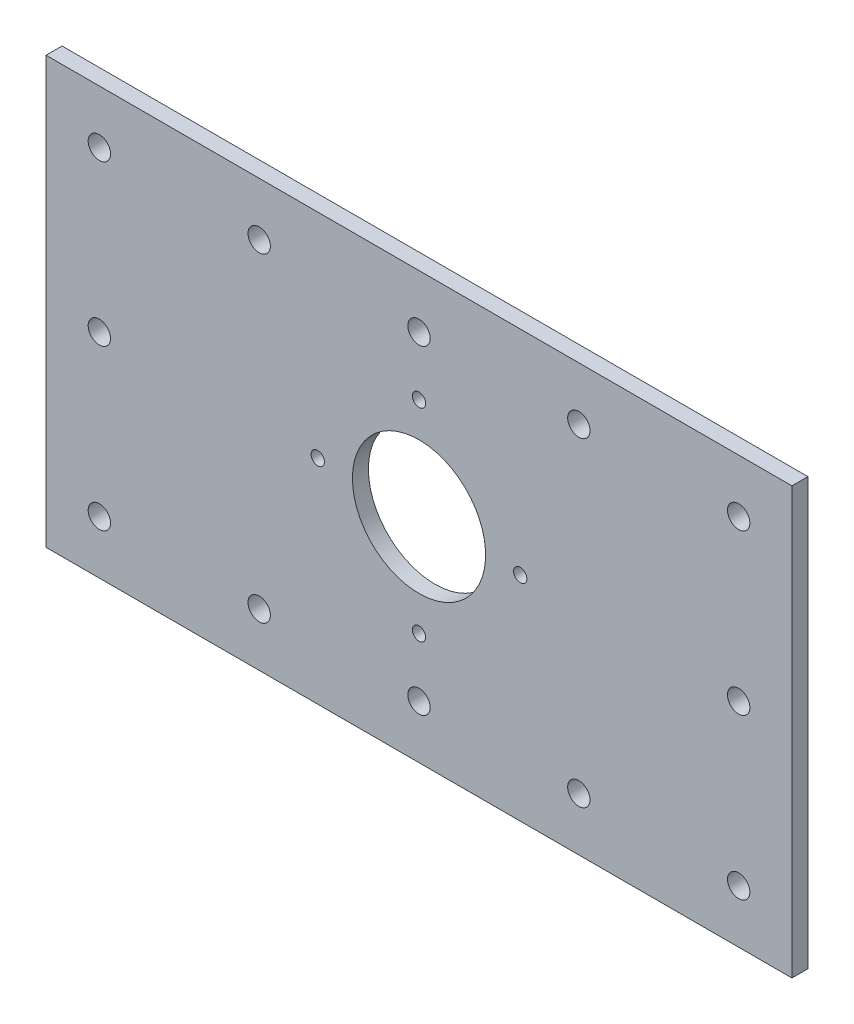
ISO-10303-21;
HEADER;
FILE_DESCRIPTION(('STEP AP214'),'2;1');
FILE_NAME('part.step','',(''),(''),'','','');
FILE_SCHEMA(('AUTOMOTIVE_DESIGN { 1 0 10303 214 1 1 1 1 }'));
ENDSEC;
DATA;
#1=APPLICATION_CONTEXT('core data for automotive mechanical design processes');
#2=APPLICATION_PROTOCOL_DEFINITION('international standard','automotive_design',2000,#1);
#3=PRODUCT_CONTEXT('',#1,'mechanical');
#4=PRODUCT('Part','Part','',(#3));
#5=PRODUCT_RELATED_PRODUCT_CATEGORY('part','',(#4));
#6=PRODUCT_DEFINITION_FORMATION('','',#4);
#7=PRODUCT_DEFINITION_CONTEXT('part definition',#1,'design');
#8=PRODUCT_DEFINITION('design','',#6,#7);
#9=PRODUCT_DEFINITION_SHAPE('','',#8);
#10=(LENGTH_UNIT() NAMED_UNIT(*) SI_UNIT(.MILLI.,.METRE.));
#11=(NAMED_UNIT(*) PLANE_ANGLE_UNIT() SI_UNIT($,.RADIAN.));
#12=(NAMED_UNIT(*) SI_UNIT($,.STERADIAN.) SOLID_ANGLE_UNIT());
#13=UNCERTAINTY_MEASURE_WITH_UNIT(LENGTH_MEASURE(1.E-05),#10,'distance_accuracy_value','');
#14=(GEOMETRIC_REPRESENTATION_CONTEXT(3) GLOBAL_UNCERTAINTY_ASSIGNED_CONTEXT((#13)) GLOBAL_UNIT_ASSIGNED_CONTEXT((#10,
#11,#12)) REPRESENTATION_CONTEXT('',''));
#15=CARTESIAN_POINT('',(0.,0.,0.));
#16=DIRECTION('',(0.,0.,1.));
#17=DIRECTION('',(1.,0.,0.));
#18=AXIS2_PLACEMENT_3D('',#15,#16,#17);
#19=CARTESIAN_POINT('',(0.,0.,3.));
#20=DIRECTION('',(0.,0.,1.));
#21=DIRECTION('',(1.,0.,0.));
#22=AXIS2_PLACEMENT_3D('',#19,#20,#21);
#23=PLANE('',#22);
#24=CARTESIAN_POINT('',(0.,0.,3.));
#25=DIRECTION('',(0.,0.,-1.));
#26=DIRECTION('',(-1.,0.,0.));
#27=AXIS2_PLACEMENT_3D('',#24,#25,#26);
#28=CIRCLE('',#27,12.5);
#29=CARTESIAN_POINT('',(-12.5,0.,3.));
#30=VERTEX_POINT('',#29);
#31=EDGE_CURVE('E258',#30,#30,#28,.T.);
#32=ORIENTED_EDGE('',*,*,#31,.T.);
#33=EDGE_LOOP('',(#32));
#34=FACE_BOUND('',#33,.T.);
#35=CARTESIAN_POINT('',(-19.,0.,3.));
#36=DIRECTION('',(0.,0.,-1.));
#37=DIRECTION('',(-1.,0.,0.));
#38=AXIS2_PLACEMENT_3D('',#35,#36,#37);
#39=CIRCLE('',#38,1.25);
#40=CARTESIAN_POINT('',(-20.25,0.,3.));
#41=VERTEX_POINT('',#40);
#42=EDGE_CURVE('E130',#41,#41,#39,.T.);
#43=ORIENTED_EDGE('',*,*,#42,.T.);
#44=EDGE_LOOP('',(#43));
#45=FACE_BOUND('',#44,.T.);
#46=CARTESIAN_POINT('',(0.,-19.,3.));
#47=DIRECTION('',(0.,0.,-1.));
#48=DIRECTION('',(-1.,0.,0.));
#49=AXIS2_PLACEMENT_3D('',#46,#47,#48);
#50=CIRCLE('',#49,1.25);
#51=CARTESIAN_POINT('',(-1.24999999999993,-19.,3.));
#52=VERTEX_POINT('',#51);
#53=EDGE_CURVE('E251',#52,#52,#50,.T.);
#54=ORIENTED_EDGE('',*,*,#53,.T.);
#55=EDGE_LOOP('',(#54));
#56=FACE_BOUND('',#55,.T.);
#57=CARTESIAN_POINT('',(19.,1.32676290876039E-13,3.));
#58=DIRECTION('',(0.,0.,-1.));
#59=DIRECTION('',(-1.,0.,0.));
#60=AXIS2_PLACEMENT_3D('',#57,#58,#59);
#61=CIRCLE('',#60,1.25);
#62=CARTESIAN_POINT('',(17.75,1.32676290876039E-13,3.));
#63=VERTEX_POINT('',#62);
#64=EDGE_CURVE('E247',#63,#63,#61,.T.);
#65=ORIENTED_EDGE('',*,*,#64,.T.);
#66=EDGE_LOOP('',(#65));
#67=FACE_BOUND('',#66,.T.);
#68=CARTESIAN_POINT('',(-1.99014436314059E-13,19.,3.));
#69=DIRECTION('',(0.,0.,-1.));
#70=DIRECTION('',(-1.,0.,0.));
#71=AXIS2_PLACEMENT_3D('',#68,#69,#70);
#72=CIRCLE('',#71,1.25);
#73=CARTESIAN_POINT('',(-1.2500000000002,19.,3.));
#74=VERTEX_POINT('',#73);
#75=EDGE_CURVE('E243',#74,#74,#72,.T.);
#76=ORIENTED_EDGE('',*,*,#75,.T.);
#77=EDGE_LOOP('',(#76));
#78=FACE_BOUND('',#77,.T.);
#79=CARTESIAN_POINT('',(60.0000000000005,0.,3.));
#80=DIRECTION('',(0.,0.,-1.));
#81=DIRECTION('',(-1.,0.,0.));
#82=AXIS2_PLACEMENT_3D('',#79,#80,#81);
#83=CIRCLE('',#82,2.1);
#84=CARTESIAN_POINT('',(57.9000000000005,0.,3.));
#85=VERTEX_POINT('',#84);
#86=EDGE_CURVE('E198',#85,#85,#83,.T.);
#87=ORIENTED_EDGE('',*,*,#86,.T.);
#88=EDGE_LOOP('',(#87));
#89=FACE_BOUND('',#88,.T.);
#90=CARTESIAN_POINT('',(60.0000000000003,-30.,3.));
#91=DIRECTION('',(0.,0.,-1.));
#92=DIRECTION('',(-1.,0.,0.));
#93=AXIS2_PLACEMENT_3D('',#90,#91,#92);
#94=CIRCLE('',#93,2.1);
#95=CARTESIAN_POINT('',(57.9000000000003,-30.,3.));
#96=VERTEX_POINT('',#95);
#97=EDGE_CURVE('E189',#96,#96,#94,.T.);
#98=ORIENTED_EDGE('',*,*,#97,.T.);
#99=EDGE_LOOP('',(#98));
#100=FACE_BOUND('',#99,.T.);
#101=CARTESIAN_POINT('',(-3.12396350297154E-13,-30.,3.));
#102=DIRECTION('',(0.,0.,-1.));
#103=DIRECTION('',(-1.,0.,0.));
#104=AXIS2_PLACEMENT_3D('',#101,#102,#103);
#105=CIRCLE('',#104,2.09999999999999);
#106=CARTESIAN_POINT('',(-2.10000000000031,-30.,3.));
#107=VERTEX_POINT('',#106);
#108=EDGE_CURVE('E213',#107,#107,#105,.T.);
#109=ORIENTED_EDGE('',*,*,#108,.T.);
#110=EDGE_LOOP('',(#109));
#111=FACE_BOUND('',#110,.T.);
#112=CARTESIAN_POINT('',(29.9999999999997,-30.,3.));
#113=DIRECTION('',(0.,0.,-1.));
#114=DIRECTION('',(-1.,0.,0.));
#115=AXIS2_PLACEMENT_3D('',#112,#113,#114);
#116=CIRCLE('',#115,2.09999999999998);
#117=CARTESIAN_POINT('',(27.8999999999997,-30.,3.));
#118=VERTEX_POINT('',#117);
#119=EDGE_CURVE('E222',#118,#118,#116,.T.);
#120=ORIENTED_EDGE('',*,*,#119,.T.);
#121=EDGE_LOOP('',(#120));
#122=FACE_BOUND('',#121,.T.);
#123=CARTESIAN_POINT('',(-30.0000000000003,-30.,3.));
#124=DIRECTION('',(0.,0.,-1.));
#125=DIRECTION('',(-1.,0.,0.));
#126=AXIS2_PLACEMENT_3D('',#123,#124,#125);
#127=CIRCLE('',#126,2.09999999999999);
#128=CARTESIAN_POINT('',(-32.1000000000003,-30.,3.));
#129=VERTEX_POINT('',#128);
#130=EDGE_CURVE('E217',#129,#129,#127,.T.);
#131=ORIENTED_EDGE('',*,*,#130,.T.);
#132=EDGE_LOOP('',(#131));
#133=FACE_BOUND('',#132,.T.);
#134=DIRECTION('',(0.,1.,0.));
#135=VECTOR('',#134,1.);
#136=CARTESIAN_POINT('',(70.,40.,3.));
#137=LINE('',#136,#135);
#138=CARTESIAN_POINT('',(70.,-40.,3.));
#139=VERTEX_POINT('',#138);
#140=CARTESIAN_POINT('',(70.,40.,3.));
#141=VERTEX_POINT('',#140);
#142=EDGE_CURVE('E93',#139,#141,#137,.T.);
#143=ORIENTED_EDGE('',*,*,#142,.T.);
#144=DIRECTION('',(-1.,0.,0.));
#145=VECTOR('',#144,1.);
#146=CARTESIAN_POINT('',(-70.,40.,3.));
#147=LINE('',#146,#145);
#148=CARTESIAN_POINT('',(-70.,40.,3.));
#149=VERTEX_POINT('',#148);
#150=EDGE_CURVE('E88',#141,#149,#147,.T.);
#151=ORIENTED_EDGE('',*,*,#150,.T.);
#152=DIRECTION('',(0.,-1.,0.));
#153=VECTOR('',#152,1.);
#154=CARTESIAN_POINT('',(-70.,40.,3.));
#155=LINE('',#154,#153);
#156=CARTESIAN_POINT('',(-70.,-40.,3.));
#157=VERTEX_POINT('',#156);
#158=EDGE_CURVE('E91',#149,#157,#155,.T.);
#159=ORIENTED_EDGE('',*,*,#158,.T.);
#160=DIRECTION('',(1.,0.,0.));
#161=VECTOR('',#160,1.);
#162=CARTESIAN_POINT('',(-70.,-40.,3.));
#163=LINE('',#162,#161);
#164=EDGE_CURVE('E58',#157,#139,#163,.T.);
#165=ORIENTED_EDGE('',*,*,#164,.T.);
#166=EDGE_LOOP('',(#143,#151,#159,#165));
#167=FACE_BOUND('',#166,.T.);
#168=CARTESIAN_POINT('',(-3.12396350297154E-13,30.,3.));
#169=DIRECTION('',(0.,0.,1.));
#170=DIRECTION('',(1.,0.,0.));
#171=AXIS2_PLACEMENT_3D('',#168,#169,#170);
#172=CIRCLE('',#171,2.1);
#173=CARTESIAN_POINT('',(2.09999999999968,30.,3.));
#174=VERTEX_POINT('',#173);
#175=EDGE_CURVE('E155',#174,#174,#172,.T.);
#176=ORIENTED_EDGE('',*,*,#175,.F.);
#177=EDGE_LOOP('',(#176));
#178=FACE_BOUND('',#177,.T.);
#179=CARTESIAN_POINT('',(-30.0000000000003,30.,3.));
#180=DIRECTION('',(0.,0.,1.));
#181=DIRECTION('',(1.,0.,0.));
#182=AXIS2_PLACEMENT_3D('',#179,#180,#181);
#183=CIRCLE('',#182,2.09999999999999);
#184=CARTESIAN_POINT('',(-27.9000000000003,30.,3.));
#185=VERTEX_POINT('',#184);
#186=EDGE_CURVE('E164',#185,#185,#183,.T.);
#187=ORIENTED_EDGE('',*,*,#186,.F.);
#188=EDGE_LOOP('',(#187));
#189=FACE_BOUND('',#188,.T.);
#190=CARTESIAN_POINT('',(-60.0000000000003,29.9999999999988,3.));
#191=DIRECTION('',(0.,0.,1.));
#192=DIRECTION('',(1.,0.,0.));
#193=AXIS2_PLACEMENT_3D('',#190,#191,#192);
#194=CIRCLE('',#193,2.1);
#195=CARTESIAN_POINT('',(-57.9000000000003,29.9999999999988,3.));
#196=VERTEX_POINT('',#195);
#197=EDGE_CURVE('E172',#196,#196,#194,.T.);
#198=ORIENTED_EDGE('',*,*,#197,.F.);
#199=EDGE_LOOP('',(#198));
#200=FACE_BOUND('',#199,.T.);
#201=CARTESIAN_POINT('',(-60.0000000000005,-1.2490009027033E-12,3.));
#202=DIRECTION('',(0.,0.,1.));
#203=DIRECTION('',(1.,0.,0.));
#204=AXIS2_PLACEMENT_3D('',#201,#202,#203);
#205=CIRCLE('',#204,2.1);
#206=CARTESIAN_POINT('',(-57.9000000000005,-1.2490009027033E-12,3.));
#207=VERTEX_POINT('',#206);
#208=EDGE_CURVE('E180',#207,#207,#205,.T.);
#209=ORIENTED_EDGE('',*,*,#208,.F.);
#210=EDGE_LOOP('',(#209));
#211=FACE_BOUND('',#210,.T.);
#212=CARTESIAN_POINT('',(-59.9999999999997,-30.0000000000013,3.));
#213=DIRECTION('',(0.,0.,1.));
#214=DIRECTION('',(1.,0.,0.));
#215=AXIS2_PLACEMENT_3D('',#212,#213,#214);
#216=CIRCLE('',#215,2.1);
#217=CARTESIAN_POINT('',(-57.8999999999997,-30.0000000000013,3.));
#218=VERTEX_POINT('',#217);
#219=EDGE_CURVE('E188',#218,#218,#216,.T.);
#220=ORIENTED_EDGE('',*,*,#219,.F.);
#221=EDGE_LOOP('',(#220));
#222=FACE_BOUND('',#221,.T.);
#223=CARTESIAN_POINT('',(59.9999999999997,30.,3.));
#224=DIRECTION('',(0.,0.,1.));
#225=DIRECTION('',(1.,0.,0.));
#226=AXIS2_PLACEMENT_3D('',#223,#224,#225);
#227=CIRCLE('',#226,2.1);
#228=CARTESIAN_POINT('',(62.0999999999997,30.,3.));
#229=VERTEX_POINT('',#228);
#230=EDGE_CURVE('E145',#229,#229,#227,.T.);
#231=ORIENTED_EDGE('',*,*,#230,.F.);
#232=EDGE_LOOP('',(#231));
#233=FACE_BOUND('',#232,.T.);
#234=CARTESIAN_POINT('',(29.9999999999997,30.,3.));
#235=DIRECTION('',(0.,0.,1.));
#236=DIRECTION('',(1.,0.,0.));
#237=AXIS2_PLACEMENT_3D('',#234,#235,#236);
#238=CIRCLE('',#237,2.1);
#239=CARTESIAN_POINT('',(32.0999999999997,30.,3.));
#240=VERTEX_POINT('',#239);
#241=EDGE_CURVE('E206',#240,#240,#238,.T.);
#242=ORIENTED_EDGE('',*,*,#241,.F.);
#243=EDGE_LOOP('',(#242));
#244=FACE_BOUND('',#243,.T.);
#245=ADVANCED_FACE('F38',(#34,#45,#56,#67,#78,#89,#100,#111,#122,#133,#167,#178,#189,#200,#211,
#222,#233,#244),#23,.T.);
#246=CARTESIAN_POINT('',(0.,0.,0.));
#247=DIRECTION('',(0.,0.,1.));
#248=DIRECTION('',(1.,0.,0.));
#249=AXIS2_PLACEMENT_3D('',#246,#247,#248);
#250=PLANE('',#249);
#251=CARTESIAN_POINT('',(0.,0.,0.));
#252=DIRECTION('',(0.,0.,1.));
#253=DIRECTION('',(1.,0.,0.));
#254=AXIS2_PLACEMENT_3D('',#251,#252,#253);
#255=CIRCLE('',#254,12.5);
#256=CARTESIAN_POINT('',(12.5,0.,0.));
#257=VERTEX_POINT('',#256);
#258=EDGE_CURVE('E42',#257,#257,#255,.T.);
#259=ORIENTED_EDGE('',*,*,#258,.T.);
#260=EDGE_LOOP('',(#259));
#261=FACE_BOUND('',#260,.T.);
#262=CARTESIAN_POINT('',(-19.,0.,0.));
#263=DIRECTION('',(0.,0.,1.));
#264=DIRECTION('',(1.,0.,0.));
#265=AXIS2_PLACEMENT_3D('',#262,#263,#264);
#266=CIRCLE('',#265,1.25);
#267=CARTESIAN_POINT('',(-17.75,0.,0.));
#268=VERTEX_POINT('',#267);
#269=EDGE_CURVE('E137',#268,#268,#266,.T.);
#270=ORIENTED_EDGE('',*,*,#269,.T.);
#271=EDGE_LOOP('',(#270));
#272=FACE_BOUND('',#271,.T.);
#273=CARTESIAN_POINT('',(0.,-19.,0.));
#274=DIRECTION('',(0.,0.,1.));
#275=DIRECTION('',(1.,0.,0.));
#276=AXIS2_PLACEMENT_3D('',#273,#274,#275);
#277=CIRCLE('',#276,1.25);
#278=CARTESIAN_POINT('',(1.25000000000007,-19.,0.));
#279=VERTEX_POINT('',#278);
#280=EDGE_CURVE('E134',#279,#279,#277,.T.);
#281=ORIENTED_EDGE('',*,*,#280,.T.);
#282=EDGE_LOOP('',(#281));
#283=FACE_BOUND('',#282,.T.);
#284=CARTESIAN_POINT('',(19.,1.32676290876039E-13,0.));
#285=DIRECTION('',(0.,0.,1.));
#286=DIRECTION('',(1.,0.,0.));
#287=AXIS2_PLACEMENT_3D('',#284,#285,#286);
#288=CIRCLE('',#287,1.25);
#289=CARTESIAN_POINT('',(20.25,1.32676290876039E-13,0.));
#290=VERTEX_POINT('',#289);
#291=EDGE_CURVE('E129',#290,#290,#288,.T.);
#292=ORIENTED_EDGE('',*,*,#291,.T.);
#293=EDGE_LOOP('',(#292));
#294=FACE_BOUND('',#293,.T.);
#295=CARTESIAN_POINT('',(-1.99014436314059E-13,19.,0.));
#296=DIRECTION('',(0.,0.,1.));
#297=DIRECTION('',(1.,0.,0.));
#298=AXIS2_PLACEMENT_3D('',#295,#296,#297);
#299=CIRCLE('',#298,1.25);
#300=CARTESIAN_POINT('',(1.2499999999998,19.,0.));
#301=VERTEX_POINT('',#300);
#302=EDGE_CURVE('E125',#301,#301,#299,.T.);
#303=ORIENTED_EDGE('',*,*,#302,.T.);
#304=EDGE_LOOP('',(#303));
#305=FACE_BOUND('',#304,.T.);
#306=CARTESIAN_POINT('',(59.9999999999997,30.,0.));
#307=DIRECTION('',(0.,0.,1.));
#308=DIRECTION('',(1.,0.,0.));
#309=AXIS2_PLACEMENT_3D('',#306,#307,#308);
#310=CIRCLE('',#309,2.1);
#311=CARTESIAN_POINT('',(62.0999999999997,30.,0.));
#312=VERTEX_POINT('',#311);
#313=EDGE_CURVE('E140',#312,#312,#310,.T.);
#314=ORIENTED_EDGE('',*,*,#313,.T.);
#315=EDGE_LOOP('',(#314));
#316=FACE_BOUND('',#315,.T.);
#317=CARTESIAN_POINT('',(-60.0000000000005,-1.2490009027033E-12,0.));
#318=DIRECTION('',(0.,0.,1.));
#319=DIRECTION('',(1.,0.,0.));
#320=AXIS2_PLACEMENT_3D('',#317,#318,#319);
#321=CIRCLE('',#320,2.1);
#322=CARTESIAN_POINT('',(-57.9000000000005,-1.2490009027033E-12,0.));
#323=VERTEX_POINT('',#322);
#324=EDGE_CURVE('E184',#323,#323,#321,.T.);
#325=ORIENTED_EDGE('',*,*,#324,.T.);
#326=EDGE_LOOP('',(#325));
#327=FACE_BOUND('',#326,.T.);
#328=CARTESIAN_POINT('',(-30.0000000000003,30.,0.));
#329=DIRECTION('',(0.,0.,1.));
#330=DIRECTION('',(1.,0.,0.));
#331=AXIS2_PLACEMENT_3D('',#328,#329,#330);
#332=CIRCLE('',#331,2.09999999999999);
#333=CARTESIAN_POINT('',(-27.9000000000003,30.,0.));
#334=VERTEX_POINT('',#333);
#335=EDGE_CURVE('E168',#334,#334,#332,.T.);
#336=ORIENTED_EDGE('',*,*,#335,.T.);
#337=EDGE_LOOP('',(#336));
#338=FACE_BOUND('',#337,.T.);
#339=DIRECTION('',(0.,1.,0.));
#340=VECTOR('',#339,1.);
#341=CARTESIAN_POINT('',(70.,40.,0.));
#342=LINE('',#341,#340);
#343=CARTESIAN_POINT('',(70.,-40.,0.));
#344=VERTEX_POINT('',#343);
#345=CARTESIAN_POINT('',(70.,40.,0.));
#346=VERTEX_POINT('',#345);
#347=EDGE_CURVE('E110',#344,#346,#342,.T.);
#348=ORIENTED_EDGE('',*,*,#347,.F.);
#349=DIRECTION('',(1.,0.,0.));
#350=VECTOR('',#349,1.);
#351=CARTESIAN_POINT('',(-70.,-40.,0.));
#352=LINE('',#351,#350);
#353=CARTESIAN_POINT('',(-70.,-40.,0.));
#354=VERTEX_POINT('',#353);
#355=EDGE_CURVE('E81',#354,#344,#352,.T.);
#356=ORIENTED_EDGE('',*,*,#355,.F.);
#357=DIRECTION('',(0.,-1.,0.));
#358=VECTOR('',#357,1.);
#359=CARTESIAN_POINT('',(-70.,40.,0.));
#360=LINE('',#359,#358);
#361=CARTESIAN_POINT('',(-70.,40.,0.));
#362=VERTEX_POINT('',#361);
#363=EDGE_CURVE('E75',#362,#354,#360,.T.);
#364=ORIENTED_EDGE('',*,*,#363,.F.);
#365=DIRECTION('',(-1.,0.,0.));
#366=VECTOR('',#365,1.);
#367=CARTESIAN_POINT('',(-70.,40.,0.));
#368=LINE('',#367,#366);
#369=EDGE_CURVE('E98',#346,#362,#368,.T.);
#370=ORIENTED_EDGE('',*,*,#369,.F.);
#371=EDGE_LOOP('',(#348,#356,#364,#370));
#372=FACE_BOUND('',#371,.T.);
#373=CARTESIAN_POINT('',(-30.0000000000003,-30.,0.));
#374=DIRECTION('',(0.,0.,-1.));
#375=DIRECTION('',(-1.,0.,0.));
#376=AXIS2_PLACEMENT_3D('',#373,#374,#375);
#377=CIRCLE('',#376,2.09999999999999);
#378=CARTESIAN_POINT('',(-32.1000000000003,-30.,0.));
#379=VERTEX_POINT('',#378);
#380=EDGE_CURVE('E114',#379,#379,#377,.T.);
#381=ORIENTED_EDGE('',*,*,#380,.F.);
#382=EDGE_LOOP('',(#381));
#383=FACE_BOUND('',#382,.T.);
#384=CARTESIAN_POINT('',(-3.12396350297154E-13,30.,0.));
#385=DIRECTION('',(0.,0.,1.));
#386=DIRECTION('',(1.,0.,0.));
#387=AXIS2_PLACEMENT_3D('',#384,#385,#386);
#388=CIRCLE('',#387,2.1);
#389=CARTESIAN_POINT('',(2.09999999999968,30.,0.));
#390=VERTEX_POINT('',#389);
#391=EDGE_CURVE('E160',#390,#390,#388,.T.);
#392=ORIENTED_EDGE('',*,*,#391,.T.);
#393=EDGE_LOOP('',(#392));
#394=FACE_BOUND('',#393,.T.);
#395=CARTESIAN_POINT('',(-60.0000000000003,29.9999999999988,0.));
#396=DIRECTION('',(0.,0.,1.));
#397=DIRECTION('',(1.,0.,0.));
#398=AXIS2_PLACEMENT_3D('',#395,#396,#397);
#399=CIRCLE('',#398,2.1);
#400=CARTESIAN_POINT('',(-57.9000000000003,29.9999999999988,0.));
#401=VERTEX_POINT('',#400);
#402=EDGE_CURVE('E176',#401,#401,#399,.T.);
#403=ORIENTED_EDGE('',*,*,#402,.T.);
#404=EDGE_LOOP('',(#403));
#405=FACE_BOUND('',#404,.T.);
#406=CARTESIAN_POINT('',(-59.9999999999997,-30.0000000000013,0.));
#407=DIRECTION('',(0.,0.,1.));
#408=DIRECTION('',(1.,0.,0.));
#409=AXIS2_PLACEMENT_3D('',#406,#407,#408);
#410=CIRCLE('',#409,2.1);
#411=CARTESIAN_POINT('',(-57.8999999999997,-30.0000000000013,0.));
#412=VERTEX_POINT('',#411);
#413=EDGE_CURVE('E151',#412,#412,#410,.T.);
#414=ORIENTED_EDGE('',*,*,#413,.T.);
#415=EDGE_LOOP('',(#414));
#416=FACE_BOUND('',#415,.T.);
#417=CARTESIAN_POINT('',(29.9999999999997,-30.,0.));
#418=DIRECTION('',(0.,0.,-1.));
#419=DIRECTION('',(-1.,0.,0.));
#420=AXIS2_PLACEMENT_3D('',#417,#418,#419);
#421=CIRCLE('',#420,2.09999999999998);
#422=CARTESIAN_POINT('',(27.8999999999997,-30.,0.));
#423=VERTEX_POINT('',#422);
#424=EDGE_CURVE('E193',#423,#423,#421,.T.);
#425=ORIENTED_EDGE('',*,*,#424,.F.);
#426=EDGE_LOOP('',(#425));
#427=FACE_BOUND('',#426,.T.);
#428=CARTESIAN_POINT('',(-3.12396350297154E-13,-30.,0.));
#429=DIRECTION('',(0.,0.,-1.));
#430=DIRECTION('',(-1.,0.,0.));
#431=AXIS2_PLACEMENT_3D('',#428,#429,#430);
#432=CIRCLE('',#431,2.09999999999999);
#433=CARTESIAN_POINT('',(-2.10000000000031,-30.,0.));
#434=VERTEX_POINT('',#433);
#435=EDGE_CURVE('E218',#434,#434,#432,.T.);
#436=ORIENTED_EDGE('',*,*,#435,.F.);
#437=EDGE_LOOP('',(#436));
#438=FACE_BOUND('',#437,.T.);
#439=CARTESIAN_POINT('',(60.0000000000003,-30.,0.));
#440=DIRECTION('',(0.,0.,-1.));
#441=DIRECTION('',(-1.,0.,0.));
#442=AXIS2_PLACEMENT_3D('',#439,#440,#441);
#443=CIRCLE('',#442,2.1);
#444=CARTESIAN_POINT('',(57.9000000000003,-30.,0.));
#445=VERTEX_POINT('',#444);
#446=EDGE_CURVE('E194',#445,#445,#443,.T.);
#447=ORIENTED_EDGE('',*,*,#446,.F.);
#448=EDGE_LOOP('',(#447));
#449=FACE_BOUND('',#448,.T.);
#450=CARTESIAN_POINT('',(60.0000000000005,0.,0.));
#451=DIRECTION('',(0.,0.,-1.));
#452=DIRECTION('',(-1.,0.,0.));
#453=AXIS2_PLACEMENT_3D('',#450,#451,#452);
#454=CIRCLE('',#453,2.1);
#455=CARTESIAN_POINT('',(57.9000000000005,0.,0.));
#456=VERTEX_POINT('',#455);
#457=EDGE_CURVE('E202',#456,#456,#454,.T.);
#458=ORIENTED_EDGE('',*,*,#457,.F.);
#459=EDGE_LOOP('',(#458));
#460=FACE_BOUND('',#459,.T.);
#461=CARTESIAN_POINT('',(29.9999999999997,30.,0.));
#462=DIRECTION('',(0.,0.,1.));
#463=DIRECTION('',(1.,0.,0.));
#464=AXIS2_PLACEMENT_3D('',#461,#462,#463);
#465=CIRCLE('',#464,2.1);
#466=CARTESIAN_POINT('',(32.0999999999997,30.,0.));
#467=VERTEX_POINT('',#466);
#468=EDGE_CURVE('E159',#467,#467,#465,.T.);
#469=ORIENTED_EDGE('',*,*,#468,.T.);
#470=EDGE_LOOP('',(#469));
#471=FACE_BOUND('',#470,.T.);
#472=ADVANCED_FACE('F267',(#261,#272,#283,#294,#305,#316,#327,#338,#372,#383,#394,#405,#416,
#427,#438,#449,#460,#471),#250,.F.);
#473=CARTESIAN_POINT('',(70.,40.,3.));
#474=DIRECTION('',(-1.,0.,0.));
#475=DIRECTION('',(0.,0.,1.));
#476=AXIS2_PLACEMENT_3D('',#473,#474,#475);
#477=PLANE('',#476);
#478=ORIENTED_EDGE('',*,*,#347,.T.);
#479=DIRECTION('',(0.,0.,-1.));
#480=VECTOR('',#479,1.);
#481=CARTESIAN_POINT('',(70.,40.,3.));
#482=LINE('',#481,#480);
#483=EDGE_CURVE('E11',#141,#346,#482,.T.);
#484=ORIENTED_EDGE('',*,*,#483,.F.);
#485=ORIENTED_EDGE('',*,*,#142,.F.);
#486=DIRECTION('',(0.,0.,-1.));
#487=VECTOR('',#486,1.);
#488=CARTESIAN_POINT('',(70.,-40.,3.));
#489=LINE('',#488,#487);
#490=EDGE_CURVE('E106',#139,#344,#489,.T.);
#491=ORIENTED_EDGE('',*,*,#490,.T.);
#492=EDGE_LOOP('',(#478,#484,#485,#491));
#493=FACE_BOUND('',#492,.T.);
#494=ADVANCED_FACE('F40',(#493),#477,.F.);
#495=CARTESIAN_POINT('',(-70.,40.,3.));
#496=DIRECTION('',(0.,-1.,0.));
#497=DIRECTION('',(0.,0.,-1.));
#498=AXIS2_PLACEMENT_3D('',#495,#496,#497);
#499=PLANE('',#498);
#500=ORIENTED_EDGE('',*,*,#369,.T.);
#501=DIRECTION('',(0.,0.,-1.));
#502=VECTOR('',#501,1.);
#503=CARTESIAN_POINT('',(-70.,40.,3.));
#504=LINE('',#503,#502);
#505=EDGE_CURVE('E49',#149,#362,#504,.T.);
#506=ORIENTED_EDGE('',*,*,#505,.F.);
#507=ORIENTED_EDGE('',*,*,#150,.F.);
#508=ORIENTED_EDGE('',*,*,#483,.T.);
#509=EDGE_LOOP('',(#500,#506,#507,#508));
#510=FACE_BOUND('',#509,.T.);
#511=ADVANCED_FACE('F97',(#510),#499,.F.);
#512=CARTESIAN_POINT('',(-70.,40.,3.));
#513=DIRECTION('',(1.,0.,0.));
#514=DIRECTION('',(0.,1.,0.));
#515=AXIS2_PLACEMENT_3D('',#512,#513,#514);
#516=PLANE('',#515);
#517=ORIENTED_EDGE('',*,*,#363,.T.);
#518=DIRECTION('',(0.,0.,-1.));
#519=VECTOR('',#518,1.);
#520=CARTESIAN_POINT('',(-70.,-40.,3.));
#521=LINE('',#520,#519);
#522=EDGE_CURVE('E100',#157,#354,#521,.T.);
#523=ORIENTED_EDGE('',*,*,#522,.F.);
#524=ORIENTED_EDGE('',*,*,#158,.F.);
#525=ORIENTED_EDGE('',*,*,#505,.T.);
#526=EDGE_LOOP('',(#517,#523,#524,#525));
#527=FACE_BOUND('',#526,.T.);
#528=ADVANCED_FACE('F102',(#527),#516,.F.);
#529=CARTESIAN_POINT('',(-70.,-40.,3.));
#530=DIRECTION('',(0.,1.,0.));
#531=DIRECTION('',(0.,0.,1.));
#532=AXIS2_PLACEMENT_3D('',#529,#530,#531);
#533=PLANE('',#532);
#534=ORIENTED_EDGE('',*,*,#355,.T.);
#535=ORIENTED_EDGE('',*,*,#490,.F.);
#536=ORIENTED_EDGE('',*,*,#164,.F.);
#537=ORIENTED_EDGE('',*,*,#522,.T.);
#538=EDGE_LOOP('',(#534,#535,#536,#537));
#539=FACE_BOUND('',#538,.T.);
#540=ADVANCED_FACE('F292',(#539),#533,.F.);
#541=CARTESIAN_POINT('',(-30.0000000000003,-30.,0.));
#542=DIRECTION('',(0.,0.,1.));
#543=DIRECTION('',(1.,0.,0.));
#544=AXIS2_PLACEMENT_3D('',#541,#542,#543);
#545=CYLINDRICAL_SURFACE('',#544,2.09999999999999);
#546=ORIENTED_EDGE('',*,*,#380,.T.);
#547=EDGE_LOOP('',(#546));
#548=FACE_BOUND('',#547,.T.);
#549=ORIENTED_EDGE('',*,*,#130,.F.);
#550=EDGE_LOOP('',(#549));
#551=FACE_BOUND('',#550,.T.);
#552=ADVANCED_FACE('F289',(#548,#551),#545,.F.);
#553=CARTESIAN_POINT('',(-3.12396350297154E-13,30.,0.));
#554=DIRECTION('',(0.,0.,1.));
#555=DIRECTION('',(1.,0.,0.));
#556=AXIS2_PLACEMENT_3D('',#553,#554,#555);
#557=CYLINDRICAL_SURFACE('',#556,2.1);
#558=ORIENTED_EDGE('',*,*,#391,.F.);
#559=EDGE_LOOP('',(#558));
#560=FACE_BOUND('',#559,.T.);
#561=ORIENTED_EDGE('',*,*,#175,.T.);
#562=EDGE_LOOP('',(#561));
#563=FACE_BOUND('',#562,.T.);
#564=ADVANCED_FACE('F363',(#560,#563),#557,.F.);
#565=CARTESIAN_POINT('',(-30.0000000000003,30.,0.));
#566=DIRECTION('',(0.,0.,1.));
#567=DIRECTION('',(1.,0.,0.));
#568=AXIS2_PLACEMENT_3D('',#565,#566,#567);
#569=CYLINDRICAL_SURFACE('',#568,2.09999999999999);
#570=ORIENTED_EDGE('',*,*,#335,.F.);
#571=EDGE_LOOP('',(#570));
#572=FACE_BOUND('',#571,.T.);
#573=ORIENTED_EDGE('',*,*,#186,.T.);
#574=EDGE_LOOP('',(#573));
#575=FACE_BOUND('',#574,.T.);
#576=ADVANCED_FACE('F368',(#572,#575),#569,.F.);
#577=CARTESIAN_POINT('',(-60.0000000000003,29.9999999999988,0.));
#578=DIRECTION('',(0.,0.,1.));
#579=DIRECTION('',(1.,0.,0.));
#580=AXIS2_PLACEMENT_3D('',#577,#578,#579);
#581=CYLINDRICAL_SURFACE('',#580,2.1);
#582=ORIENTED_EDGE('',*,*,#402,.F.);
#583=EDGE_LOOP('',(#582));
#584=FACE_BOUND('',#583,.T.);
#585=ORIENTED_EDGE('',*,*,#197,.T.);
#586=EDGE_LOOP('',(#585));
#587=FACE_BOUND('',#586,.T.);
#588=ADVANCED_FACE('F374',(#584,#587),#581,.F.);
#589=CARTESIAN_POINT('',(-60.0000000000005,-1.2490009027033E-12,0.));
#590=DIRECTION('',(0.,0.,1.));
#591=DIRECTION('',(1.,0.,0.));
#592=AXIS2_PLACEMENT_3D('',#589,#590,#591);
#593=CYLINDRICAL_SURFACE('',#592,2.1);
#594=ORIENTED_EDGE('',*,*,#324,.F.);
#595=EDGE_LOOP('',(#594));
#596=FACE_BOUND('',#595,.T.);
#597=ORIENTED_EDGE('',*,*,#208,.T.);
#598=EDGE_LOOP('',(#597));
#599=FACE_BOUND('',#598,.T.);
#600=ADVANCED_FACE('F382',(#596,#599),#593,.F.);
#601=CARTESIAN_POINT('',(-59.9999999999997,-30.0000000000013,0.));
#602=DIRECTION('',(0.,0.,1.));
#603=DIRECTION('',(1.,0.,0.));
#604=AXIS2_PLACEMENT_3D('',#601,#602,#603);
#605=CYLINDRICAL_SURFACE('',#604,2.1);
#606=ORIENTED_EDGE('',*,*,#413,.F.);
#607=EDGE_LOOP('',(#606));
#608=FACE_BOUND('',#607,.T.);
#609=ORIENTED_EDGE('',*,*,#219,.T.);
#610=EDGE_LOOP('',(#609));
#611=FACE_BOUND('',#610,.T.);
#612=ADVANCED_FACE('F353',(#608,#611),#605,.F.);
#613=CARTESIAN_POINT('',(59.9999999999997,30.,0.));
#614=DIRECTION('',(0.,0.,1.));
#615=DIRECTION('',(1.,0.,0.));
#616=AXIS2_PLACEMENT_3D('',#613,#614,#615);
#617=CYLINDRICAL_SURFACE('',#616,2.1);
#618=ORIENTED_EDGE('',*,*,#313,.F.);
#619=EDGE_LOOP('',(#618));
#620=FACE_BOUND('',#619,.T.);
#621=ORIENTED_EDGE('',*,*,#230,.T.);
#622=EDGE_LOOP('',(#621));
#623=FACE_BOUND('',#622,.T.);
#624=ADVANCED_FACE('F348',(#620,#623),#617,.F.);
#625=CARTESIAN_POINT('',(29.9999999999997,-30.,0.));
#626=DIRECTION('',(0.,0.,1.));
#627=DIRECTION('',(1.,0.,0.));
#628=AXIS2_PLACEMENT_3D('',#625,#626,#627);
#629=CYLINDRICAL_SURFACE('',#628,2.09999999999998);
#630=ORIENTED_EDGE('',*,*,#424,.T.);
#631=EDGE_LOOP('',(#630));
#632=FACE_BOUND('',#631,.T.);
#633=ORIENTED_EDGE('',*,*,#119,.F.);
#634=EDGE_LOOP('',(#633));
#635=FACE_BOUND('',#634,.T.);
#636=ADVANCED_FACE('F345',(#632,#635),#629,.F.);
#637=CARTESIAN_POINT('',(-3.12396350297154E-13,-30.,0.));
#638=DIRECTION('',(0.,0.,1.));
#639=DIRECTION('',(1.,0.,0.));
#640=AXIS2_PLACEMENT_3D('',#637,#638,#639);
#641=CYLINDRICAL_SURFACE('',#640,2.09999999999999);
#642=ORIENTED_EDGE('',*,*,#435,.T.);
#643=EDGE_LOOP('',(#642));
#644=FACE_BOUND('',#643,.T.);
#645=ORIENTED_EDGE('',*,*,#108,.F.);
#646=EDGE_LOOP('',(#645));
#647=FACE_BOUND('',#646,.T.);
#648=ADVANCED_FACE('F343',(#644,#647),#641,.F.);
#649=CARTESIAN_POINT('',(60.0000000000003,-30.,0.));
#650=DIRECTION('',(0.,0.,1.));
#651=DIRECTION('',(1.,0.,0.));
#652=AXIS2_PLACEMENT_3D('',#649,#650,#651);
#653=CYLINDRICAL_SURFACE('',#652,2.1);
#654=ORIENTED_EDGE('',*,*,#446,.T.);
#655=EDGE_LOOP('',(#654));
#656=FACE_BOUND('',#655,.T.);
#657=ORIENTED_EDGE('',*,*,#97,.F.);
#658=EDGE_LOOP('',(#657));
#659=FACE_BOUND('',#658,.T.);
#660=ADVANCED_FACE('F338',(#656,#659),#653,.F.);
#661=CARTESIAN_POINT('',(60.0000000000005,0.,0.));
#662=DIRECTION('',(0.,0.,1.));
#663=DIRECTION('',(1.,0.,0.));
#664=AXIS2_PLACEMENT_3D('',#661,#662,#663);
#665=CYLINDRICAL_SURFACE('',#664,2.1);
#666=ORIENTED_EDGE('',*,*,#457,.T.);
#667=EDGE_LOOP('',(#666));
#668=FACE_BOUND('',#667,.T.);
#669=ORIENTED_EDGE('',*,*,#86,.F.);
#670=EDGE_LOOP('',(#669));
#671=FACE_BOUND('',#670,.T.);
#672=ADVANCED_FACE('F327',(#668,#671),#665,.F.);
#673=CARTESIAN_POINT('',(29.9999999999997,30.,0.));
#674=DIRECTION('',(0.,0.,1.));
#675=DIRECTION('',(1.,0.,0.));
#676=AXIS2_PLACEMENT_3D('',#673,#674,#675);
#677=CYLINDRICAL_SURFACE('',#676,2.1);
#678=ORIENTED_EDGE('',*,*,#468,.F.);
#679=EDGE_LOOP('',(#678));
#680=FACE_BOUND('',#679,.T.);
#681=ORIENTED_EDGE('',*,*,#241,.T.);
#682=EDGE_LOOP('',(#681));
#683=FACE_BOUND('',#682,.T.);
#684=ADVANCED_FACE('F323',(#680,#683),#677,.F.);
#685=CARTESIAN_POINT('',(-1.99014436314059E-13,19.,3.));
#686=DIRECTION('',(0.,0.,-1.));
#687=DIRECTION('',(-1.,0.,0.));
#688=AXIS2_PLACEMENT_3D('',#685,#686,#687);
#689=CYLINDRICAL_SURFACE('',#688,1.25);
#690=ORIENTED_EDGE('',*,*,#75,.F.);
#691=EDGE_LOOP('',(#690));
#692=FACE_BOUND('',#691,.T.);
#693=ORIENTED_EDGE('',*,*,#302,.F.);
#694=EDGE_LOOP('',(#693));
#695=FACE_BOUND('',#694,.T.);
#696=ADVANCED_FACE('F326',(#692,#695),#689,.F.);
#697=CARTESIAN_POINT('',(19.,1.32676290876039E-13,3.));
#698=DIRECTION('',(0.,0.,-1.));
#699=DIRECTION('',(-1.,0.,0.));
#700=AXIS2_PLACEMENT_3D('',#697,#698,#699);
#701=CYLINDRICAL_SURFACE('',#700,1.25);
#702=ORIENTED_EDGE('',*,*,#64,.F.);
#703=EDGE_LOOP('',(#702));
#704=FACE_BOUND('',#703,.T.);
#705=ORIENTED_EDGE('',*,*,#291,.F.);
#706=EDGE_LOOP('',(#705));
#707=FACE_BOUND('',#706,.T.);
#708=ADVANCED_FACE('F335',(#704,#707),#701,.F.);
#709=CARTESIAN_POINT('',(0.,-19.,3.));
#710=DIRECTION('',(0.,0.,-1.));
#711=DIRECTION('',(-1.,0.,0.));
#712=AXIS2_PLACEMENT_3D('',#709,#710,#711);
#713=CYLINDRICAL_SURFACE('',#712,1.25);
#714=ORIENTED_EDGE('',*,*,#53,.F.);
#715=EDGE_LOOP('',(#714));
#716=FACE_BOUND('',#715,.T.);
#717=ORIENTED_EDGE('',*,*,#280,.F.);
#718=EDGE_LOOP('',(#717));
#719=FACE_BOUND('',#718,.T.);
#720=ADVANCED_FACE('F277',(#716,#719),#713,.F.);
#721=CARTESIAN_POINT('',(-19.,0.,3.));
#722=DIRECTION('',(0.,0.,-1.));
#723=DIRECTION('',(-1.,0.,0.));
#724=AXIS2_PLACEMENT_3D('',#721,#722,#723);
#725=CYLINDRICAL_SURFACE('',#724,1.25);
#726=ORIENTED_EDGE('',*,*,#42,.F.);
#727=EDGE_LOOP('',(#726));
#728=FACE_BOUND('',#727,.T.);
#729=ORIENTED_EDGE('',*,*,#269,.F.);
#730=EDGE_LOOP('',(#729));
#731=FACE_BOUND('',#730,.T.);
#732=ADVANCED_FACE('F271',(#728,#731),#725,.F.);
#733=CARTESIAN_POINT('',(0.,0.,3.));
#734=DIRECTION('',(0.,0.,-1.));
#735=DIRECTION('',(-1.,0.,0.));
#736=AXIS2_PLACEMENT_3D('',#733,#734,#735);
#737=CYLINDRICAL_SURFACE('',#736,12.5);
#738=ORIENTED_EDGE('',*,*,#31,.F.);
#739=EDGE_LOOP('',(#738));
#740=FACE_BOUND('',#739,.T.);
#741=ORIENTED_EDGE('',*,*,#258,.F.);
#742=EDGE_LOOP('',(#741));
#743=FACE_BOUND('',#742,.T.);
#744=ADVANCED_FACE('F269',(#740,#743),#737,.F.);
#745=CLOSED_SHELL('',(#245,#472,#494,#511,#528,#540,#552,#564,#576,#588,#600,#612,#624,#636,
#648,#660,#672,#684,#696,#708,#720,#732,#744));
#746=MANIFOLD_SOLID_BREP('B2',#745);
#747=ADVANCED_BREP_SHAPE_REPRESENTATION('',(#18,#746),#14);
#748=SHAPE_DEFINITION_REPRESENTATION(#9,#747);
ENDSEC;
END-ISO-10303-21;
